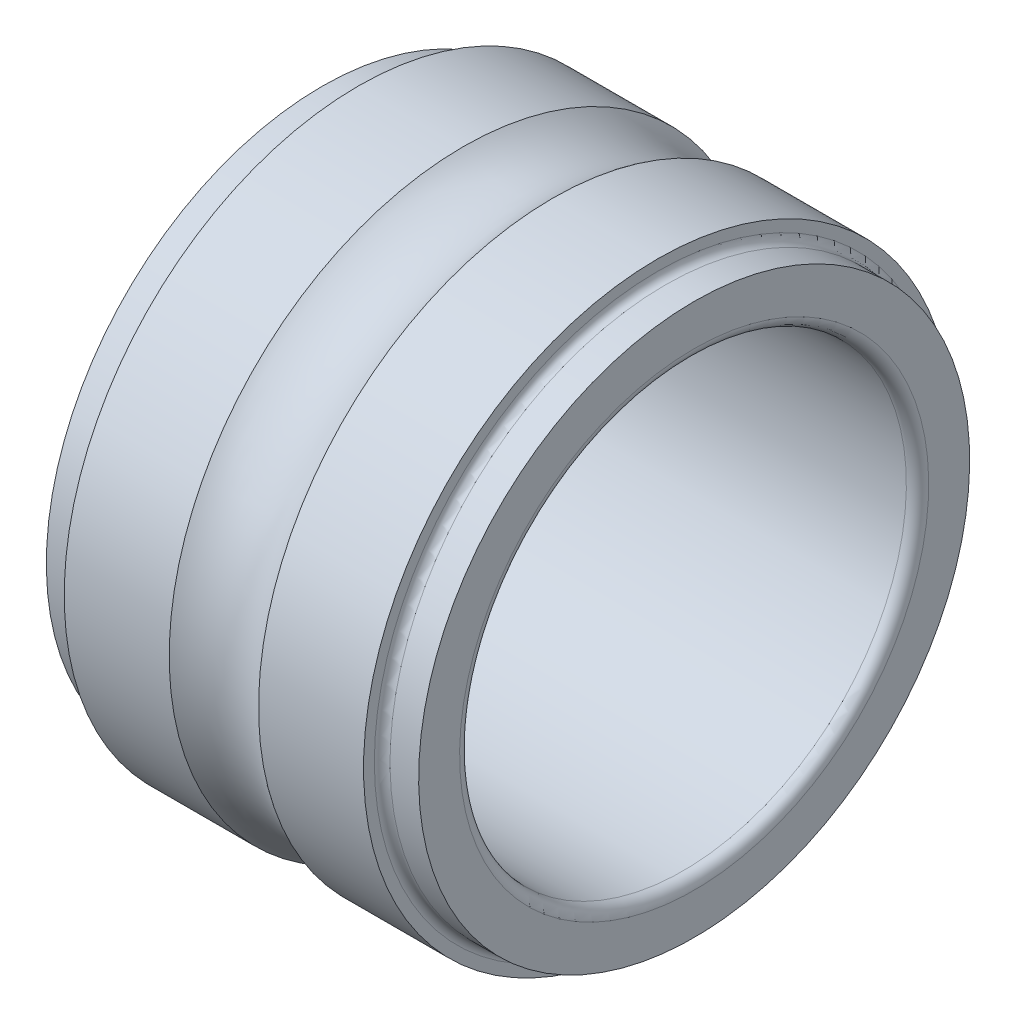
ISO-10303-21;
HEADER;
FILE_DESCRIPTION(('STEP AP214'),'2;1');
FILE_NAME('part.step','',(''),(''),'','','');
FILE_SCHEMA(('AUTOMOTIVE_DESIGN { 1 0 10303 214 1 1 1 1 }'));
ENDSEC;
DATA;
#1=APPLICATION_CONTEXT('core data for automotive mechanical design processes');
#2=APPLICATION_PROTOCOL_DEFINITION('international standard','automotive_design',2000,#1);
#3=PRODUCT_CONTEXT('',#1,'mechanical');
#4=PRODUCT('Part','Part','',(#3));
#5=PRODUCT_RELATED_PRODUCT_CATEGORY('part','',(#4));
#6=PRODUCT_DEFINITION_FORMATION('','',#4);
#7=PRODUCT_DEFINITION_CONTEXT('part definition',#1,'design');
#8=PRODUCT_DEFINITION('design','',#6,#7);
#9=PRODUCT_DEFINITION_SHAPE('','',#8);
#10=(LENGTH_UNIT() NAMED_UNIT(*) SI_UNIT(.MILLI.,.METRE.));
#11=(NAMED_UNIT(*) PLANE_ANGLE_UNIT() SI_UNIT($,.RADIAN.));
#12=(NAMED_UNIT(*) SI_UNIT($,.STERADIAN.) SOLID_ANGLE_UNIT());
#13=UNCERTAINTY_MEASURE_WITH_UNIT(LENGTH_MEASURE(1.E-05),#10,'distance_accuracy_value','');
#14=(GEOMETRIC_REPRESENTATION_CONTEXT(3) GLOBAL_UNCERTAINTY_ASSIGNED_CONTEXT((#13)) GLOBAL_UNIT_ASSIGNED_CONTEXT((#10,
#11,#12)) REPRESENTATION_CONTEXT('',''));
#15=CARTESIAN_POINT('',(0.,0.,0.));
#16=DIRECTION('',(0.,0.,1.));
#17=DIRECTION('',(1.,0.,0.));
#18=AXIS2_PLACEMENT_3D('',#15,#16,#17);
#19=CARTESIAN_POINT('',(3.805,0.,0.));
#20=DIRECTION('',(-1.,0.,0.));
#21=DIRECTION('',(0.,1.,0.));
#22=AXIS2_PLACEMENT_3D('',#19,#20,#21);
#23=CYLINDRICAL_SURFACE('',#22,3.95);
#24=CARTESIAN_POINT('',(3.1,0.,0.));
#25=DIRECTION('',(-1.,0.,0.));
#26=DIRECTION('',(0.,1.,0.));
#27=AXIS2_PLACEMENT_3D('',#24,#25,#26);
#28=CIRCLE('',#27,3.95);
#29=CARTESIAN_POINT('',(3.1,3.95,0.));
#30=VERTEX_POINT('',#29);
#31=EDGE_CURVE('E11',#30,#30,#28,.T.);
#32=ORIENTED_EDGE('',*,*,#31,.F.);
#33=EDGE_LOOP('',(#32));
#34=FACE_BOUND('',#33,.T.);
#35=CARTESIAN_POINT('',(4.51,0.,0.));
#36=DIRECTION('',(-1.,0.,0.));
#37=DIRECTION('',(0.,1.,0.));
#38=AXIS2_PLACEMENT_3D('',#35,#36,#37);
#39=CIRCLE('',#38,3.95);
#40=CARTESIAN_POINT('',(4.51,3.95,0.));
#41=VERTEX_POINT('',#40);
#42=EDGE_CURVE('E72',#41,#41,#39,.T.);
#43=ORIENTED_EDGE('',*,*,#42,.T.);
#44=EDGE_LOOP('',(#43));
#45=FACE_BOUND('',#44,.T.);
#46=ADVANCED_FACE('F37',(#34,#45),#23,.T.);
#47=CARTESIAN_POINT('',(2.5,0.,0.));
#48=DIRECTION('',(1.,0.,0.));
#49=DIRECTION('',(0.,0.,1.));
#50=AXIS2_PLACEMENT_3D('',#47,#48,#49);
#51=TOROIDAL_SURFACE('',#50,4.75,1.);
#52=CARTESIAN_POINT('',(1.9,0.,0.));
#53=DIRECTION('',(-1.,0.,0.));
#54=DIRECTION('',(0.,1.,0.));
#55=AXIS2_PLACEMENT_3D('',#52,#53,#54);
#56=CIRCLE('',#55,3.95);
#57=CARTESIAN_POINT('',(1.9,3.95,0.));
#58=VERTEX_POINT('',#57);
#59=EDGE_CURVE('E47',#58,#58,#56,.T.);
#60=ORIENTED_EDGE('',*,*,#59,.F.);
#61=EDGE_LOOP('',(#60));
#62=FACE_BOUND('',#61,.T.);
#63=ORIENTED_EDGE('',*,*,#31,.T.);
#64=EDGE_LOOP('',(#63));
#65=FACE_BOUND('',#64,.T.);
#66=ADVANCED_FACE('F148',(#62,#65),#51,.F.);
#67=CARTESIAN_POINT('',(1.195,0.,0.));
#68=DIRECTION('',(-1.,0.,0.));
#69=DIRECTION('',(0.,1.,0.));
#70=AXIS2_PLACEMENT_3D('',#67,#68,#69);
#71=CYLINDRICAL_SURFACE('',#70,3.95);
#72=CARTESIAN_POINT('',(0.49,0.,0.));
#73=DIRECTION('',(-1.,0.,0.));
#74=DIRECTION('',(0.,1.,0.));
#75=AXIS2_PLACEMENT_3D('',#72,#73,#74);
#76=CIRCLE('',#75,3.95);
#77=CARTESIAN_POINT('',(0.49,3.95,0.));
#78=VERTEX_POINT('',#77);
#79=EDGE_CURVE('E103',#78,#78,#76,.T.);
#80=ORIENTED_EDGE('',*,*,#79,.F.);
#81=EDGE_LOOP('',(#80));
#82=FACE_BOUND('',#81,.T.);
#83=ORIENTED_EDGE('',*,*,#59,.T.);
#84=EDGE_LOOP('',(#83));
#85=FACE_BOUND('',#84,.T.);
#86=ADVANCED_FACE('F153',(#82,#85),#71,.T.);
#87=CARTESIAN_POINT('',(0.49,3.8775,0.));
#88=DIRECTION('',(-1.,0.,0.));
#89=DIRECTION('',(0.,-1.,0.));
#90=AXIS2_PLACEMENT_3D('',#87,#88,#89);
#91=PLANE('',#90);
#92=CARTESIAN_POINT('',(0.49,0.,0.));
#93=DIRECTION('',(-1.,0.,0.));
#94=DIRECTION('',(0.,1.,0.));
#95=AXIS2_PLACEMENT_3D('',#92,#93,#94);
#96=CIRCLE('',#95,3.805);
#97=CARTESIAN_POINT('',(0.49,3.805,0.));
#98=VERTEX_POINT('',#97);
#99=EDGE_CURVE('E41',#98,#98,#96,.T.);
#100=ORIENTED_EDGE('',*,*,#99,.F.);
#101=EDGE_LOOP('',(#100));
#102=FACE_BOUND('',#101,.T.);
#103=ORIENTED_EDGE('',*,*,#79,.T.);
#104=EDGE_LOOP('',(#103));
#105=FACE_BOUND('',#104,.T.);
#106=ADVANCED_FACE('F143',(#102,#105),#91,.T.);
#107=CARTESIAN_POINT('',(0.385,0.,0.));
#108=DIRECTION('',(1.,0.,0.));
#109=DIRECTION('',(0.,0.,1.));
#110=AXIS2_PLACEMENT_3D('',#107,#108,#109);
#111=TOROIDAL_SURFACE('',#110,3.805,0.105);
#112=CARTESIAN_POINT('',(0.385,0.,0.));
#113=DIRECTION('',(-1.,0.,0.));
#114=DIRECTION('',(0.,1.,0.));
#115=AXIS2_PLACEMENT_3D('',#112,#113,#114);
#116=CIRCLE('',#115,3.7);
#117=CARTESIAN_POINT('',(0.385,3.7,0.));
#118=VERTEX_POINT('',#117);
#119=EDGE_CURVE('E108',#118,#118,#116,.T.);
#120=ORIENTED_EDGE('',*,*,#119,.F.);
#121=EDGE_LOOP('',(#120));
#122=FACE_BOUND('',#121,.T.);
#123=ORIENTED_EDGE('',*,*,#99,.T.);
#124=EDGE_LOOP('',(#123));
#125=FACE_BOUND('',#124,.T.);
#126=ADVANCED_FACE('F39',(#122,#125),#111,.F.);
#127=CARTESIAN_POINT('',(0.1925,0.,0.));
#128=DIRECTION('',(-1.,0.,0.));
#129=DIRECTION('',(0.,1.,0.));
#130=AXIS2_PLACEMENT_3D('',#127,#128,#129);
#131=CYLINDRICAL_SURFACE('',#130,3.7);
#132=CARTESIAN_POINT('',(0.,0.,0.));
#133=DIRECTION('',(-1.,0.,0.));
#134=DIRECTION('',(0.,1.,0.));
#135=AXIS2_PLACEMENT_3D('',#132,#133,#134);
#136=CIRCLE('',#135,3.7);
#137=CARTESIAN_POINT('',(0.,3.7,0.));
#138=VERTEX_POINT('',#137);
#139=EDGE_CURVE('E110',#138,#138,#136,.T.);
#140=ORIENTED_EDGE('',*,*,#139,.F.);
#141=EDGE_LOOP('',(#140));
#142=FACE_BOUND('',#141,.T.);
#143=ORIENTED_EDGE('',*,*,#119,.T.);
#144=EDGE_LOOP('',(#143));
#145=FACE_BOUND('',#144,.T.);
#146=ADVANCED_FACE('F134',(#142,#145),#131,.T.);
#147=CARTESIAN_POINT('',(0.,3.425,0.));
#148=DIRECTION('',(-1.,0.,0.));
#149=DIRECTION('',(0.,-1.,0.));
#150=AXIS2_PLACEMENT_3D('',#147,#148,#149);
#151=PLANE('',#150);
#152=CARTESIAN_POINT('',(0.,0.,0.));
#153=DIRECTION('',(-1.,0.,0.));
#154=DIRECTION('',(0.,1.,0.));
#155=AXIS2_PLACEMENT_3D('',#152,#153,#154);
#156=CIRCLE('',#155,3.15);
#157=CARTESIAN_POINT('',(0.,3.15,0.));
#158=VERTEX_POINT('',#157);
#159=EDGE_CURVE('E115',#158,#158,#156,.T.);
#160=ORIENTED_EDGE('',*,*,#159,.F.);
#161=EDGE_LOOP('',(#160));
#162=FACE_BOUND('',#161,.T.);
#163=ORIENTED_EDGE('',*,*,#139,.T.);
#164=EDGE_LOOP('',(#163));
#165=FACE_BOUND('',#164,.T.);
#166=ADVANCED_FACE('F131',(#162,#165),#151,.T.);
#167=CARTESIAN_POINT('',(0.15,0.,0.));
#168=DIRECTION('',(1.,0.,0.));
#169=DIRECTION('',(0.,0.,1.));
#170=AXIS2_PLACEMENT_3D('',#167,#168,#169);
#171=TOROIDAL_SURFACE('',#170,3.15,0.15);
#172=CARTESIAN_POINT('',(0.15,0.,0.));
#173=DIRECTION('',(-1.,0.,0.));
#174=DIRECTION('',(0.,1.,0.));
#175=AXIS2_PLACEMENT_3D('',#172,#173,#174);
#176=CIRCLE('',#175,3.);
#177=CARTESIAN_POINT('',(0.15,3.,0.));
#178=VERTEX_POINT('',#177);
#179=EDGE_CURVE('E124',#178,#178,#176,.T.);
#180=ORIENTED_EDGE('',*,*,#179,.F.);
#181=EDGE_LOOP('',(#180));
#182=FACE_BOUND('',#181,.T.);
#183=ORIENTED_EDGE('',*,*,#159,.T.);
#184=EDGE_LOOP('',(#183));
#185=FACE_BOUND('',#184,.T.);
#186=ADVANCED_FACE('F129',(#182,#185),#171,.T.);
#187=CARTESIAN_POINT('',(2.5,0.,0.));
#188=DIRECTION('',(-1.,0.,0.));
#189=DIRECTION('',(0.,1.,0.));
#190=AXIS2_PLACEMENT_3D('',#187,#188,#189);
#191=CYLINDRICAL_SURFACE('',#190,3.);
#192=CARTESIAN_POINT('',(4.85,0.,0.));
#193=DIRECTION('',(-1.,0.,0.));
#194=DIRECTION('',(0.,1.,0.));
#195=AXIS2_PLACEMENT_3D('',#192,#193,#194);
#196=CIRCLE('',#195,3.);
#197=CARTESIAN_POINT('',(4.85,3.,0.));
#198=VERTEX_POINT('',#197);
#199=EDGE_CURVE('E88',#198,#198,#196,.T.);
#200=ORIENTED_EDGE('',*,*,#199,.F.);
#201=EDGE_LOOP('',(#200));
#202=FACE_BOUND('',#201,.T.);
#203=ORIENTED_EDGE('',*,*,#179,.T.);
#204=EDGE_LOOP('',(#203));
#205=FACE_BOUND('',#204,.T.);
#206=ADVANCED_FACE('F179',(#202,#205),#191,.F.);
#207=CARTESIAN_POINT('',(4.85,0.,0.));
#208=DIRECTION('',(1.,0.,0.));
#209=DIRECTION('',(0.,0.,1.));
#210=AXIS2_PLACEMENT_3D('',#207,#208,#209);
#211=TOROIDAL_SURFACE('',#210,3.15,0.15);
#212=CARTESIAN_POINT('',(5.,0.,0.));
#213=DIRECTION('',(-1.,0.,0.));
#214=DIRECTION('',(0.,1.,0.));
#215=AXIS2_PLACEMENT_3D('',#212,#213,#214);
#216=CIRCLE('',#215,3.15);
#217=CARTESIAN_POINT('',(5.,3.15,0.));
#218=VERTEX_POINT('',#217);
#219=EDGE_CURVE('E94',#218,#218,#216,.T.);
#220=ORIENTED_EDGE('',*,*,#219,.F.);
#221=EDGE_LOOP('',(#220));
#222=FACE_BOUND('',#221,.T.);
#223=ORIENTED_EDGE('',*,*,#199,.T.);
#224=EDGE_LOOP('',(#223));
#225=FACE_BOUND('',#224,.T.);
#226=ADVANCED_FACE('F181',(#222,#225),#211,.T.);
#227=CARTESIAN_POINT('',(5.,3.425,0.));
#228=DIRECTION('',(1.,0.,0.));
#229=DIRECTION('',(0.,1.,0.));
#230=AXIS2_PLACEMENT_3D('',#227,#228,#229);
#231=PLANE('',#230);
#232=CARTESIAN_POINT('',(5.,0.,0.));
#233=DIRECTION('',(-1.,0.,0.));
#234=DIRECTION('',(0.,1.,0.));
#235=AXIS2_PLACEMENT_3D('',#232,#233,#234);
#236=CIRCLE('',#235,3.7);
#237=CARTESIAN_POINT('',(5.,3.7,0.));
#238=VERTEX_POINT('',#237);
#239=EDGE_CURVE('E98',#238,#238,#236,.T.);
#240=ORIENTED_EDGE('',*,*,#239,.F.);
#241=EDGE_LOOP('',(#240));
#242=FACE_BOUND('',#241,.T.);
#243=ORIENTED_EDGE('',*,*,#219,.T.);
#244=EDGE_LOOP('',(#243));
#245=FACE_BOUND('',#244,.T.);
#246=ADVANCED_FACE('F164',(#242,#245),#231,.T.);
#247=CARTESIAN_POINT('',(4.8075,0.,0.));
#248=DIRECTION('',(-1.,0.,0.));
#249=DIRECTION('',(0.,1.,0.));
#250=AXIS2_PLACEMENT_3D('',#247,#248,#249);
#251=CYLINDRICAL_SURFACE('',#250,3.7);
#252=CARTESIAN_POINT('',(4.615,0.,0.));
#253=DIRECTION('',(-1.,0.,0.));
#254=DIRECTION('',(0.,1.,0.));
#255=AXIS2_PLACEMENT_3D('',#252,#253,#254);
#256=CIRCLE('',#255,3.7);
#257=CARTESIAN_POINT('',(4.615,3.7,0.));
#258=VERTEX_POINT('',#257);
#259=EDGE_CURVE('E119',#258,#258,#256,.T.);
#260=ORIENTED_EDGE('',*,*,#259,.F.);
#261=EDGE_LOOP('',(#260));
#262=FACE_BOUND('',#261,.T.);
#263=ORIENTED_EDGE('',*,*,#239,.T.);
#264=EDGE_LOOP('',(#263));
#265=FACE_BOUND('',#264,.T.);
#266=ADVANCED_FACE('F162',(#262,#265),#251,.T.);
#267=CARTESIAN_POINT('',(4.615,0.,0.));
#268=DIRECTION('',(1.,0.,0.));
#269=DIRECTION('',(0.,0.,1.));
#270=AXIS2_PLACEMENT_3D('',#267,#268,#269);
#271=TOROIDAL_SURFACE('',#270,3.805,0.105);
#272=CARTESIAN_POINT('',(4.51,0.,0.));
#273=DIRECTION('',(-1.,0.,0.));
#274=DIRECTION('',(0.,1.,0.));
#275=AXIS2_PLACEMENT_3D('',#272,#273,#274);
#276=CIRCLE('',#275,3.805);
#277=CARTESIAN_POINT('',(4.51,3.805,0.));
#278=VERTEX_POINT('',#277);
#279=EDGE_CURVE('E77',#278,#278,#276,.T.);
#280=ORIENTED_EDGE('',*,*,#279,.F.);
#281=EDGE_LOOP('',(#280));
#282=FACE_BOUND('',#281,.T.);
#283=ORIENTED_EDGE('',*,*,#259,.T.);
#284=EDGE_LOOP('',(#283));
#285=FACE_BOUND('',#284,.T.);
#286=ADVANCED_FACE('F159',(#282,#285),#271,.F.);
#287=CARTESIAN_POINT('',(4.51,3.8775,0.));
#288=DIRECTION('',(1.,0.,0.));
#289=DIRECTION('',(0.,1.,0.));
#290=AXIS2_PLACEMENT_3D('',#287,#288,#289);
#291=PLANE('',#290);
#292=ORIENTED_EDGE('',*,*,#42,.F.);
#293=EDGE_LOOP('',(#292));
#294=FACE_BOUND('',#293,.T.);
#295=ORIENTED_EDGE('',*,*,#279,.T.);
#296=EDGE_LOOP('',(#295));
#297=FACE_BOUND('',#296,.T.);
#298=ADVANCED_FACE('F157',(#294,#297),#291,.T.);
#299=CLOSED_SHELL('',(#46,#66,#86,#106,#126,#146,#166,#186,#206,#226,#246,#266,#286,#298));
#300=MANIFOLD_SOLID_BREP('B2',#299);
#301=ADVANCED_BREP_SHAPE_REPRESENTATION('',(#18,#300),#14);
#302=SHAPE_DEFINITION_REPRESENTATION(#9,#301);
ENDSEC;
END-ISO-10303-21;
